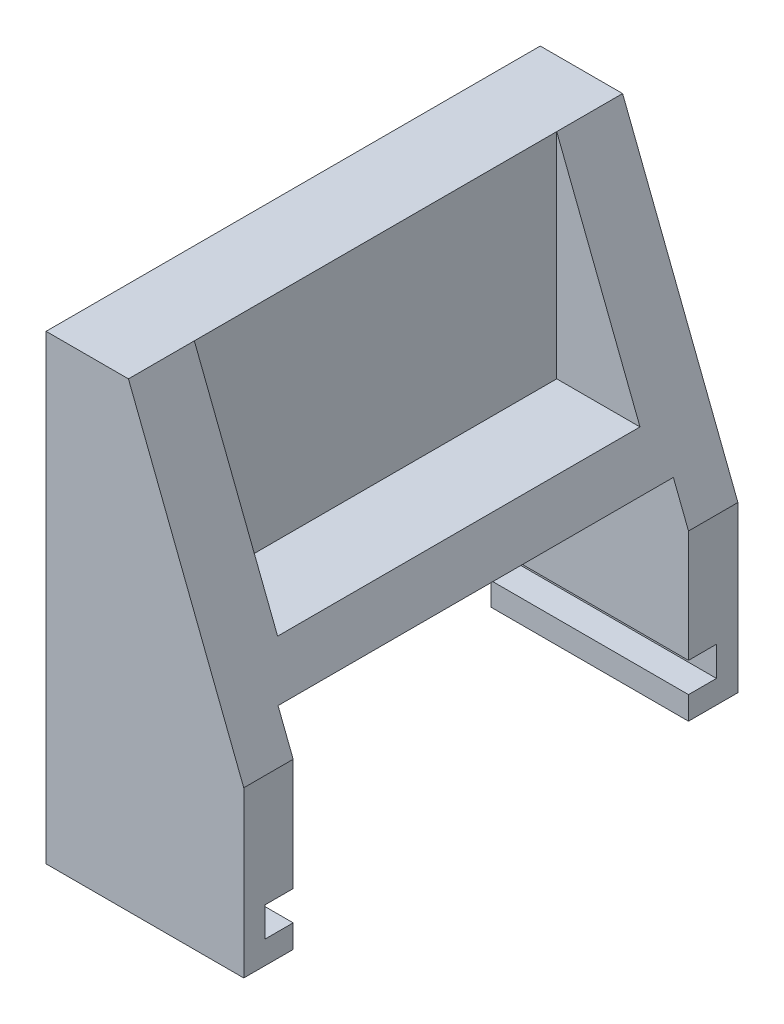
ISO-10303-21;
HEADER;
FILE_DESCRIPTION(('STEP AP214'),'2;1');
FILE_NAME('part.step','',(''),(''),'','','');
FILE_SCHEMA(('AUTOMOTIVE_DESIGN { 1 0 10303 214 1 1 1 1 }'));
ENDSEC;
DATA;
#1=APPLICATION_CONTEXT('core data for automotive mechanical design processes');
#2=APPLICATION_PROTOCOL_DEFINITION('international standard','automotive_design',2000,#1);
#3=PRODUCT_CONTEXT('',#1,'mechanical');
#4=PRODUCT('Part','Part','',(#3));
#5=PRODUCT_RELATED_PRODUCT_CATEGORY('part','',(#4));
#6=PRODUCT_DEFINITION_FORMATION('','',#4);
#7=PRODUCT_DEFINITION_CONTEXT('part definition',#1,'design');
#8=PRODUCT_DEFINITION('design','',#6,#7);
#9=PRODUCT_DEFINITION_SHAPE('','',#8);
#10=(LENGTH_UNIT() NAMED_UNIT(*) SI_UNIT(.MILLI.,.METRE.));
#11=(NAMED_UNIT(*) PLANE_ANGLE_UNIT() SI_UNIT($,.RADIAN.));
#12=(NAMED_UNIT(*) SI_UNIT($,.STERADIAN.) SOLID_ANGLE_UNIT());
#13=UNCERTAINTY_MEASURE_WITH_UNIT(LENGTH_MEASURE(1.E-05),#10,'distance_accuracy_value','');
#14=(GEOMETRIC_REPRESENTATION_CONTEXT(3) GLOBAL_UNCERTAINTY_ASSIGNED_CONTEXT((#13)) GLOBAL_UNIT_ASSIGNED_CONTEXT((#10,
#11,#12)) REPRESENTATION_CONTEXT('',''));
#15=CARTESIAN_POINT('',(0.,0.,0.));
#16=DIRECTION('',(0.,0.,1.));
#17=DIRECTION('',(1.,0.,0.));
#18=AXIS2_PLACEMENT_3D('',#15,#16,#17);
#19=CARTESIAN_POINT('',(12.,-28.,-30.));
#20=DIRECTION('',(1.,0.,0.));
#21=DIRECTION('',(0.,0.,-1.));
#22=AXIS2_PLACEMENT_3D('',#19,#20,#21);
#23=PLANE('',#22);
#24=DIRECTION('',(0.,-1.,0.));
#25=VECTOR('',#24,1.);
#26=CARTESIAN_POINT('',(12.,-28.,-28.7));
#27=LINE('',#26,#25);
#28=CARTESIAN_POINT('',(12.,-24.8,-28.7));
#29=VERTEX_POINT('',#28);
#30=CARTESIAN_POINT('',(12.,-26.6,-28.7));
#31=VERTEX_POINT('',#30);
#32=EDGE_CURVE('E321',#29,#31,#27,.T.);
#33=ORIENTED_EDGE('',*,*,#32,.T.);
#34=DIRECTION('',(0.,0.,1.));
#35=VECTOR('',#34,1.);
#36=CARTESIAN_POINT('',(12.,-26.6,-30.));
#37=LINE('',#36,#35);
#38=CARTESIAN_POINT('',(12.,-26.6,-27.));
#39=VERTEX_POINT('',#38);
#40=EDGE_CURVE('E317',#31,#39,#37,.T.);
#41=ORIENTED_EDGE('',*,*,#40,.T.);
#42=DIRECTION('',(0.,1.,0.));
#43=VECTOR('',#42,1.);
#44=CARTESIAN_POINT('',(12.,-28.,-27.));
#45=LINE('',#44,#43);
#46=CARTESIAN_POINT('',(12.,-28.,-27.));
#47=VERTEX_POINT('',#46);
#48=EDGE_CURVE('E392',#47,#39,#45,.T.);
#49=ORIENTED_EDGE('',*,*,#48,.F.);
#50=DIRECTION('',(0.,0.,1.));
#51=VECTOR('',#50,1.);
#52=CARTESIAN_POINT('',(12.,-28.,-30.));
#53=LINE('',#52,#51);
#54=CARTESIAN_POINT('',(12.,-28.,-30.));
#55=VERTEX_POINT('',#54);
#56=EDGE_CURVE('E451',#55,#47,#53,.T.);
#57=ORIENTED_EDGE('',*,*,#56,.F.);
#58=DIRECTION('',(0.,1.,0.));
#59=VECTOR('',#58,1.);
#60=CARTESIAN_POINT('',(12.,-28.,-30.));
#61=LINE('',#60,#59);
#62=CARTESIAN_POINT('',(12.,-18.,-30.));
#63=VERTEX_POINT('',#62);
#64=EDGE_CURVE('E413',#55,#63,#61,.T.);
#65=ORIENTED_EDGE('',*,*,#64,.T.);
#66=DIRECTION('',(0.,0.,1.));
#67=VECTOR('',#66,1.);
#68=CARTESIAN_POINT('',(12.,-18.,-30.));
#69=LINE('',#68,#67);
#70=CARTESIAN_POINT('',(12.,-18.,-27.));
#71=VERTEX_POINT('',#70);
#72=EDGE_CURVE('E446',#63,#71,#69,.T.);
#73=ORIENTED_EDGE('',*,*,#72,.T.);
#74=CARTESIAN_POINT('',(12.,-24.8,-27.));
#75=VERTEX_POINT('',#74);
#76=EDGE_CURVE('E391',#75,#71,#45,.T.);
#77=ORIENTED_EDGE('',*,*,#76,.F.);
#78=DIRECTION('',(0.,0.,-1.));
#79=VECTOR('',#78,1.);
#80=CARTESIAN_POINT('',(12.,-24.8,-30.));
#81=LINE('',#80,#79);
#82=EDGE_CURVE('E311',#75,#29,#81,.T.);
#83=ORIENTED_EDGE('',*,*,#82,.T.);
#84=EDGE_LOOP('',(#33,#41,#49,#57,#65,#73,#77,#83));
#85=FACE_BOUND('',#84,.T.);
#86=ADVANCED_FACE('F39',(#85),#23,.T.);
#87=CARTESIAN_POINT('',(0.,0.,-30.));
#88=DIRECTION('',(-1.,0.,0.));
#89=DIRECTION('',(0.,-1.,0.));
#90=AXIS2_PLACEMENT_3D('',#87,#88,#89);
#91=PLANE('',#90);
#92=DIRECTION('',(0.,0.,-1.));
#93=VECTOR('',#92,1.);
#94=CARTESIAN_POINT('',(0.,-12.,-12.));
#95=LINE('',#94,#93);
#96=CARTESIAN_POINT('',(0.,-12.,-12.));
#97=VERTEX_POINT('',#96);
#98=CARTESIAN_POINT('',(0.,-12.,-15.));
#99=VERTEX_POINT('',#98);
#100=EDGE_CURVE('E239',#97,#99,#95,.T.);
#101=ORIENTED_EDGE('',*,*,#100,.F.);
#102=DIRECTION('',(0.,-1.,0.));
#103=VECTOR('',#102,1.);
#104=CARTESIAN_POINT('',(0.,-12.,-12.));
#105=LINE('',#104,#103);
#106=CARTESIAN_POINT('',(0.,-15.,-12.));
#107=VERTEX_POINT('',#106);
#108=EDGE_CURVE('E864',#97,#107,#105,.T.);
#109=ORIENTED_EDGE('',*,*,#108,.T.);
#110=DIRECTION('',(0.,0.,-1.));
#111=VECTOR('',#110,1.);
#112=CARTESIAN_POINT('',(0.,-15.,-12.));
#113=LINE('',#112,#111);
#114=CARTESIAN_POINT('',(0.,-15.,-15.));
#115=VERTEX_POINT('',#114);
#116=EDGE_CURVE('E255',#107,#115,#113,.T.);
#117=ORIENTED_EDGE('',*,*,#116,.T.);
#118=DIRECTION('',(0.,-1.,0.));
#119=VECTOR('',#118,1.);
#120=CARTESIAN_POINT('',(0.,-12.,-15.));
#121=LINE('',#120,#119);
#122=EDGE_CURVE('E55',#99,#115,#121,.T.);
#123=ORIENTED_EDGE('',*,*,#122,.F.);
#124=EDGE_LOOP('',(#101,#109,#117,#123));
#125=FACE_BOUND('',#124,.T.);
#126=DIRECTION('',(0.,-1.,0.));
#127=VECTOR('',#126,1.);
#128=CARTESIAN_POINT('',(0.,-15.6385994006733,-27.));
#129=LINE('',#128,#127);
#130=CARTESIAN_POINT('',(0.,-26.6,-27.));
#131=VERTEX_POINT('',#130);
#132=CARTESIAN_POINT('',(0.,-28.,-27.));
#133=VERTEX_POINT('',#132);
#134=EDGE_CURVE('E360',#131,#133,#129,.T.);
#135=ORIENTED_EDGE('',*,*,#134,.F.);
#136=DIRECTION('',(0.,0.,-1.));
#137=VECTOR('',#136,1.);
#138=CARTESIAN_POINT('',(0.,-26.6,-27.));
#139=LINE('',#138,#137);
#140=CARTESIAN_POINT('',(0.,-26.6,-28.7));
#141=VERTEX_POINT('',#140);
#142=EDGE_CURVE('E303',#131,#141,#139,.T.);
#143=ORIENTED_EDGE('',*,*,#142,.T.);
#144=DIRECTION('',(0.,1.,0.));
#145=VECTOR('',#144,1.);
#146=CARTESIAN_POINT('',(0.,-24.8,-28.7));
#147=LINE('',#146,#145);
#148=CARTESIAN_POINT('',(0.,-24.8,-28.7));
#149=VERTEX_POINT('',#148);
#150=EDGE_CURVE('E299',#141,#149,#147,.T.);
#151=ORIENTED_EDGE('',*,*,#150,.T.);
#152=DIRECTION('',(0.,0.,1.));
#153=VECTOR('',#152,1.);
#154=CARTESIAN_POINT('',(0.,-24.8,-27.));
#155=LINE('',#154,#153);
#156=CARTESIAN_POINT('',(0.,-24.8,-27.));
#157=VERTEX_POINT('',#156);
#158=EDGE_CURVE('E290',#149,#157,#155,.T.);
#159=ORIENTED_EDGE('',*,*,#158,.T.);
#160=CARTESIAN_POINT('',(0.,-15.6385994006733,-27.));
#161=VERTEX_POINT('',#160);
#162=EDGE_CURVE('E361',#161,#157,#129,.T.);
#163=ORIENTED_EDGE('',*,*,#162,.F.);
#164=DIRECTION('',(0.,0.,1.));
#165=VECTOR('',#164,1.);
#166=CARTESIAN_POINT('',(0.,-15.6385994006733,-27.));
#167=LINE('',#166,#165);
#168=CARTESIAN_POINT('',(0.,-15.6385994006733,-3.));
#169=VERTEX_POINT('',#168);
#170=EDGE_CURVE('E356',#161,#169,#167,.T.);
#171=ORIENTED_EDGE('',*,*,#170,.T.);
#172=DIRECTION('',(0.,-1.,0.));
#173=VECTOR('',#172,1.);
#174=CARTESIAN_POINT('',(0.,-15.6385994006733,-3.));
#175=LINE('',#174,#173);
#176=CARTESIAN_POINT('',(0.,-24.8,-3.));
#177=VERTEX_POINT('',#176);
#178=EDGE_CURVE('E352',#169,#177,#175,.T.);
#179=ORIENTED_EDGE('',*,*,#178,.T.);
#180=DIRECTION('',(0.,0.,-1.));
#181=VECTOR('',#180,1.);
#182=CARTESIAN_POINT('',(0.,-24.8,-3.));
#183=LINE('',#182,#181);
#184=CARTESIAN_POINT('',(0.,-24.8,-1.3));
#185=VERTEX_POINT('',#184);
#186=EDGE_CURVE('E333',#185,#177,#183,.T.);
#187=ORIENTED_EDGE('',*,*,#186,.F.);
#188=DIRECTION('',(0.,1.,0.));
#189=VECTOR('',#188,1.);
#190=CARTESIAN_POINT('',(0.,-24.8,-1.3));
#191=LINE('',#190,#189);
#192=CARTESIAN_POINT('',(0.,-26.6,-1.3));
#193=VERTEX_POINT('',#192);
#194=EDGE_CURVE('E329',#193,#185,#191,.T.);
#195=ORIENTED_EDGE('',*,*,#194,.F.);
#196=DIRECTION('',(0.,0.,1.));
#197=VECTOR('',#196,1.);
#198=CARTESIAN_POINT('',(0.,-26.6,-3.));
#199=LINE('',#198,#197);
#200=CARTESIAN_POINT('',(0.,-26.6,-3.));
#201=VERTEX_POINT('',#200);
#202=EDGE_CURVE('E325',#201,#193,#199,.T.);
#203=ORIENTED_EDGE('',*,*,#202,.F.);
#204=CARTESIAN_POINT('',(0.,-28.,-3.));
#205=VERTEX_POINT('',#204);
#206=EDGE_CURVE('E351',#201,#205,#175,.T.);
#207=ORIENTED_EDGE('',*,*,#206,.T.);
#208=DIRECTION('',(0.,0.,1.));
#209=VECTOR('',#208,1.);
#210=CARTESIAN_POINT('',(0.,-28.,-30.));
#211=LINE('',#210,#209);
#212=CARTESIAN_POINT('',(0.,-28.,0.));
#213=VERTEX_POINT('',#212);
#214=EDGE_CURVE('E460',#205,#213,#211,.T.);
#215=ORIENTED_EDGE('',*,*,#214,.T.);
#216=DIRECTION('',(0.,-1.,0.));
#217=VECTOR('',#216,1.);
#218=CARTESIAN_POINT('',(0.,0.,0.));
#219=LINE('',#218,#217);
#220=CARTESIAN_POINT('',(0.,0.,0.));
#221=VERTEX_POINT('',#220);
#222=EDGE_CURVE('E425',#221,#213,#219,.T.);
#223=ORIENTED_EDGE('',*,*,#222,.F.);
#224=DIRECTION('',(0.,0.,1.));
#225=VECTOR('',#224,1.);
#226=CARTESIAN_POINT('',(0.,0.,-30.));
#227=LINE('',#226,#225);
#228=CARTESIAN_POINT('',(0.,0.,-30.));
#229=VERTEX_POINT('',#228);
#230=EDGE_CURVE('E421',#229,#221,#227,.T.);
#231=ORIENTED_EDGE('',*,*,#230,.F.);
#232=DIRECTION('',(0.,-1.,0.));
#233=VECTOR('',#232,1.);
#234=CARTESIAN_POINT('',(0.,0.,-30.));
#235=LINE('',#234,#233);
#236=CARTESIAN_POINT('',(0.,-28.,-30.));
#237=VERTEX_POINT('',#236);
#238=EDGE_CURVE('E404',#229,#237,#235,.T.);
#239=ORIENTED_EDGE('',*,*,#238,.T.);
#240=EDGE_CURVE('E456',#237,#133,#211,.T.);
#241=ORIENTED_EDGE('',*,*,#240,.T.);
#242=EDGE_LOOP('',(#135,#143,#151,#159,#163,#171,#179,#187,#195,#203,#207,#215,#223,#231,#239,#241));
#243=FACE_BOUND('',#242,.T.);
#244=ADVANCED_FACE('F252',(#125,#243),#91,.T.);
#245=CARTESIAN_POINT('',(25.,-15.6385994006733,-27.));
#246=DIRECTION('',(0.,0.,-1.));
#247=DIRECTION('',(0.,1.,0.));
#248=AXIS2_PLACEMENT_3D('',#245,#246,#247);
#249=PLANE('',#248);
#250=DIRECTION('',(1.,0.,0.));
#251=VECTOR('',#250,1.);
#252=CARTESIAN_POINT('',(25.,-26.6,-27.));
#253=LINE('',#252,#251);
#254=EDGE_CURVE('E471',#131,#39,#253,.T.);
#255=ORIENTED_EDGE('',*,*,#254,.F.);
#256=ORIENTED_EDGE('',*,*,#134,.T.);
#257=DIRECTION('',(1.,0.,0.));
#258=VECTOR('',#257,1.);
#259=CARTESIAN_POINT('',(0.,-28.,-27.));
#260=LINE('',#259,#258);
#261=EDGE_CURVE('E388',#133,#47,#260,.T.);
#262=ORIENTED_EDGE('',*,*,#261,.T.);
#263=ORIENTED_EDGE('',*,*,#48,.T.);
#264=EDGE_LOOP('',(#255,#256,#262,#263));
#265=FACE_BOUND('',#264,.T.);
#266=ADVANCED_FACE('F498',(#265),#249,.F.);
#267=DIRECTION('',(-1.,0.,0.));
#268=VECTOR('',#267,1.);
#269=CARTESIAN_POINT('',(25.,-24.8,-27.));
#270=LINE('',#269,#268);
#271=EDGE_CURVE('E468',#75,#157,#270,.T.);
#272=ORIENTED_EDGE('',*,*,#271,.F.);
#273=ORIENTED_EDGE('',*,*,#76,.T.);
#274=DIRECTION('',(-0.362446261154949,0.932004671541296,0.));
#275=VECTOR('',#274,1.);
#276=CARTESIAN_POINT('',(12.,-18.,-27.));
#277=LINE('',#276,#275);
#278=CARTESIAN_POINT('',(11.0816775447063,-15.6385994006733,-27.));
#279=VERTEX_POINT('',#278);
#280=EDGE_CURVE('E396',#71,#279,#277,.T.);
#281=ORIENTED_EDGE('',*,*,#280,.T.);
#282=DIRECTION('',(-1.,0.,0.));
#283=VECTOR('',#282,1.);
#284=CARTESIAN_POINT('',(25.,-15.6385994006733,-27.));
#285=LINE('',#284,#283);
#286=EDGE_CURVE('E366',#279,#161,#285,.T.);
#287=ORIENTED_EDGE('',*,*,#286,.T.);
#288=ORIENTED_EDGE('',*,*,#162,.T.);
#289=EDGE_LOOP('',(#272,#273,#281,#287,#288));
#290=FACE_BOUND('',#289,.T.);
#291=ADVANCED_FACE('F513',(#290),#249,.F.);
#292=CARTESIAN_POINT('',(25.,-15.6385994006733,-3.));
#293=DIRECTION('',(0.,0.,-1.));
#294=DIRECTION('',(-1.,0.,0.));
#295=AXIS2_PLACEMENT_3D('',#292,#293,#294);
#296=PLANE('',#295);
#297=DIRECTION('',(1.,0.,0.));
#298=VECTOR('',#297,1.);
#299=CARTESIAN_POINT('',(25.,-24.8,-3.));
#300=LINE('',#299,#298);
#301=CARTESIAN_POINT('',(12.,-24.8,-3.));
#302=VERTEX_POINT('',#301);
#303=EDGE_CURVE('E465',#177,#302,#300,.T.);
#304=ORIENTED_EDGE('',*,*,#303,.F.);
#305=ORIENTED_EDGE('',*,*,#178,.F.);
#306=DIRECTION('',(-1.,0.,0.));
#307=VECTOR('',#306,1.);
#308=CARTESIAN_POINT('',(25.,-15.6385994006733,-3.));
#309=LINE('',#308,#307);
#310=CARTESIAN_POINT('',(11.0816775447063,-15.6385994006733,-3.));
#311=VERTEX_POINT('',#310);
#312=EDGE_CURVE('E365',#311,#169,#309,.T.);
#313=ORIENTED_EDGE('',*,*,#312,.F.);
#314=DIRECTION('',(-0.362446261154949,0.932004671541296,0.));
#315=VECTOR('',#314,1.);
#316=CARTESIAN_POINT('',(12.,-18.,-3.));
#317=LINE('',#316,#315);
#318=CARTESIAN_POINT('',(12.,-18.,-3.));
#319=VERTEX_POINT('',#318);
#320=EDGE_CURVE('E380',#319,#311,#317,.T.);
#321=ORIENTED_EDGE('',*,*,#320,.F.);
#322=DIRECTION('',(0.,1.,0.));
#323=VECTOR('',#322,1.);
#324=CARTESIAN_POINT('',(12.,-28.,-3.));
#325=LINE('',#324,#323);
#326=EDGE_CURVE('E375',#302,#319,#325,.T.);
#327=ORIENTED_EDGE('',*,*,#326,.F.);
#328=EDGE_LOOP('',(#304,#305,#313,#321,#327));
#329=FACE_BOUND('',#328,.T.);
#330=ADVANCED_FACE('F504',(#329),#296,.T.);
#331=DIRECTION('',(0.,0.,1.));
#332=VECTOR('',#331,1.);
#333=CARTESIAN_POINT('',(12.,-24.8,-30.));
#334=LINE('',#333,#332);
#335=CARTESIAN_POINT('',(12.,-24.8,-1.3));
#336=VERTEX_POINT('',#335);
#337=EDGE_CURVE('E345',#302,#336,#334,.T.);
#338=ORIENTED_EDGE('',*,*,#337,.F.);
#339=ORIENTED_EDGE('',*,*,#326,.T.);
#340=CARTESIAN_POINT('',(12.,-18.,0.));
#341=VERTEX_POINT('',#340);
#342=EDGE_CURVE('E450',#319,#341,#69,.T.);
#343=ORIENTED_EDGE('',*,*,#342,.T.);
#344=DIRECTION('',(0.,1.,0.));
#345=VECTOR('',#344,1.);
#346=CARTESIAN_POINT('',(12.,-28.,0.));
#347=LINE('',#346,#345);
#348=CARTESIAN_POINT('',(12.,-28.,0.));
#349=VERTEX_POINT('',#348);
#350=EDGE_CURVE('E433',#349,#341,#347,.T.);
#351=ORIENTED_EDGE('',*,*,#350,.F.);
#352=CARTESIAN_POINT('',(12.,-28.,-3.));
#353=VERTEX_POINT('',#352);
#354=EDGE_CURVE('E455',#353,#349,#53,.T.);
#355=ORIENTED_EDGE('',*,*,#354,.F.);
#356=CARTESIAN_POINT('',(12.,-26.6,-3.));
#357=VERTEX_POINT('',#356);
#358=EDGE_CURVE('E376',#353,#357,#325,.T.);
#359=ORIENTED_EDGE('',*,*,#358,.T.);
#360=DIRECTION('',(0.,0.,-1.));
#361=VECTOR('',#360,1.);
#362=CARTESIAN_POINT('',(12.,-26.6,-30.));
#363=LINE('',#362,#361);
#364=CARTESIAN_POINT('',(12.,-26.6,-1.3));
#365=VERTEX_POINT('',#364);
#366=EDGE_CURVE('E340',#365,#357,#363,.T.);
#367=ORIENTED_EDGE('',*,*,#366,.F.);
#368=DIRECTION('',(0.,-1.,0.));
#369=VECTOR('',#368,1.);
#370=CARTESIAN_POINT('',(12.,-28.,-1.3));
#371=LINE('',#370,#369);
#372=EDGE_CURVE('E348',#336,#365,#371,.T.);
#373=ORIENTED_EDGE('',*,*,#372,.F.);
#374=EDGE_LOOP('',(#338,#339,#343,#351,#355,#359,#367,#373));
#375=FACE_BOUND('',#374,.T.);
#376=ADVANCED_FACE('F494',(#375),#23,.T.);
#377=CARTESIAN_POINT('',(0.,-28.,-30.));
#378=DIRECTION('',(0.,-1.,0.));
#379=DIRECTION('',(0.,0.,-1.));
#380=AXIS2_PLACEMENT_3D('',#377,#378,#379);
#381=PLANE('',#380);
#382=ORIENTED_EDGE('',*,*,#214,.F.);
#383=DIRECTION('',(1.,0.,0.));
#384=VECTOR('',#383,1.);
#385=CARTESIAN_POINT('',(0.,-28.,-3.));
#386=LINE('',#385,#384);
#387=EDGE_CURVE('E369',#205,#353,#386,.T.);
#388=ORIENTED_EDGE('',*,*,#387,.T.);
#389=ORIENTED_EDGE('',*,*,#354,.T.);
#390=DIRECTION('',(1.,0.,0.));
#391=VECTOR('',#390,1.);
#392=CARTESIAN_POINT('',(0.,-28.,0.));
#393=LINE('',#392,#391);
#394=EDGE_CURVE('E429',#213,#349,#393,.T.);
#395=ORIENTED_EDGE('',*,*,#394,.F.);
#396=EDGE_LOOP('',(#382,#388,#389,#395));
#397=FACE_BOUND('',#396,.T.);
#398=ADVANCED_FACE('F503',(#397),#381,.T.);
#399=CARTESIAN_POINT('',(5.,0.,-30.));
#400=DIRECTION('',(0.,1.,0.));
#401=DIRECTION('',(-1.,0.,0.));
#402=AXIS2_PLACEMENT_3D('',#399,#400,#401);
#403=PLANE('',#402);
#404=DIRECTION('',(-1.,0.,0.));
#405=VECTOR('',#404,1.);
#406=CARTESIAN_POINT('',(5.,0.,0.));
#407=LINE('',#406,#405);
#408=CARTESIAN_POINT('',(5.,0.,0.));
#409=VERTEX_POINT('',#408);
#410=EDGE_CURVE('E399',#409,#221,#407,.T.);
#411=ORIENTED_EDGE('',*,*,#410,.F.);
#412=DIRECTION('',(0.,0.,1.));
#413=VECTOR('',#412,1.);
#414=CARTESIAN_POINT('',(5.,0.,-30.));
#415=LINE('',#414,#413);
#416=CARTESIAN_POINT('',(5.,0.,-4.));
#417=VERTEX_POINT('',#416);
#418=EDGE_CURVE('E445',#417,#409,#415,.T.);
#419=ORIENTED_EDGE('',*,*,#418,.F.);
#420=DIRECTION('',(0.,0.,1.));
#421=VECTOR('',#420,1.);
#422=CARTESIAN_POINT('',(5.,0.,-26.));
#423=LINE('',#422,#421);
#424=CARTESIAN_POINT('',(5.,0.,-26.));
#425=VERTEX_POINT('',#424);
#426=EDGE_CURVE('E279',#425,#417,#423,.T.);
#427=ORIENTED_EDGE('',*,*,#426,.F.);
#428=CARTESIAN_POINT('',(5.,0.,-30.));
#429=VERTEX_POINT('',#428);
#430=EDGE_CURVE('E440',#429,#425,#415,.T.);
#431=ORIENTED_EDGE('',*,*,#430,.F.);
#432=DIRECTION('',(-1.,0.,0.));
#433=VECTOR('',#432,1.);
#434=CARTESIAN_POINT('',(5.,0.,-30.));
#435=LINE('',#434,#433);
#436=EDGE_CURVE('E400',#429,#229,#435,.T.);
#437=ORIENTED_EDGE('',*,*,#436,.T.);
#438=ORIENTED_EDGE('',*,*,#230,.T.);
#439=EDGE_LOOP('',(#411,#419,#427,#431,#437,#438));
#440=FACE_BOUND('',#439,.T.);
#441=ADVANCED_FACE('F510',(#440),#403,.T.);
#442=CARTESIAN_POINT('',(12.,-18.,-30.));
#443=DIRECTION('',(0.932004671541296,0.362446261154949,0.));
#444=DIRECTION('',(-0.362446261154949,0.932004671541296,0.));
#445=AXIS2_PLACEMENT_3D('',#442,#443,#444);
#446=PLANE('',#445);
#447=DIRECTION('',(-0.362446261154949,0.932004671541296,0.));
#448=VECTOR('',#447,1.);
#449=CARTESIAN_POINT('',(10.0555555555556,-13.,-26.));
#450=LINE('',#449,#448);
#451=CARTESIAN_POINT('',(10.0555555555556,-13.,-26.));
#452=VERTEX_POINT('',#451);
#453=EDGE_CURVE('E267',#452,#425,#450,.T.);
#454=ORIENTED_EDGE('',*,*,#453,.F.);
#455=DIRECTION('',(0.,0.,1.));
#456=VECTOR('',#455,1.);
#457=CARTESIAN_POINT('',(10.0555555555556,-13.,-26.));
#458=LINE('',#457,#456);
#459=CARTESIAN_POINT('',(10.0555555555556,-13.,-4.));
#460=VERTEX_POINT('',#459);
#461=EDGE_CURVE('E286',#452,#460,#458,.T.);
#462=ORIENTED_EDGE('',*,*,#461,.T.);
#463=DIRECTION('',(-0.362446261154949,0.932004671541296,0.));
#464=VECTOR('',#463,1.);
#465=CARTESIAN_POINT('',(10.0555555555556,-13.,-4.));
#466=LINE('',#465,#464);
#467=EDGE_CURVE('E257',#460,#417,#466,.T.);
#468=ORIENTED_EDGE('',*,*,#467,.T.);
#469=ORIENTED_EDGE('',*,*,#418,.T.);
#470=DIRECTION('',(-0.362446261154949,0.932004671541296,0.));
#471=VECTOR('',#470,1.);
#472=CARTESIAN_POINT('',(12.,-18.,0.));
#473=LINE('',#472,#471);
#474=EDGE_CURVE('E405',#341,#409,#473,.T.);
#475=ORIENTED_EDGE('',*,*,#474,.F.);
#476=ORIENTED_EDGE('',*,*,#342,.F.);
#477=ORIENTED_EDGE('',*,*,#320,.T.);
#478=DIRECTION('',(0.,0.,-1.));
#479=VECTOR('',#478,1.);
#480=CARTESIAN_POINT('',(11.0816775447063,-15.6385994006733,-30.));
#481=LINE('',#480,#479);
#482=EDGE_CURVE('E384',#311,#279,#481,.T.);
#483=ORIENTED_EDGE('',*,*,#482,.T.);
#484=ORIENTED_EDGE('',*,*,#280,.F.);
#485=ORIENTED_EDGE('',*,*,#72,.F.);
#486=DIRECTION('',(-0.362446261154949,0.932004671541296,0.));
#487=VECTOR('',#486,1.);
#488=CARTESIAN_POINT('',(12.,-18.,-30.));
#489=LINE('',#488,#487);
#490=EDGE_CURVE('E417',#63,#429,#489,.T.);
#491=ORIENTED_EDGE('',*,*,#490,.T.);
#492=ORIENTED_EDGE('',*,*,#430,.T.);
#493=EDGE_LOOP('',(#454,#462,#468,#469,#475,#476,#477,#483,#484,#485,#491,#492));
#494=FACE_BOUND('',#493,.T.);
#495=ADVANCED_FACE('F552',(#494),#446,.T.);
#496=ORIENTED_EDGE('',*,*,#261,.F.);
#497=ORIENTED_EDGE('',*,*,#240,.F.);
#498=DIRECTION('',(1.,0.,0.));
#499=VECTOR('',#498,1.);
#500=CARTESIAN_POINT('',(0.,-28.,-30.));
#501=LINE('',#500,#499);
#502=EDGE_CURVE('E409',#237,#55,#501,.T.);
#503=ORIENTED_EDGE('',*,*,#502,.T.);
#504=ORIENTED_EDGE('',*,*,#56,.T.);
#505=EDGE_LOOP('',(#496,#497,#503,#504));
#506=FACE_BOUND('',#505,.T.);
#507=ADVANCED_FACE('F512',(#506),#381,.T.);
#508=CARTESIAN_POINT('',(0.,0.,-30.));
#509=DIRECTION('',(0.,0.,1.));
#510=DIRECTION('',(1.,0.,0.));
#511=AXIS2_PLACEMENT_3D('',#508,#509,#510);
#512=PLANE('',#511);
#513=ORIENTED_EDGE('',*,*,#436,.F.);
#514=ORIENTED_EDGE('',*,*,#490,.F.);
#515=ORIENTED_EDGE('',*,*,#64,.F.);
#516=ORIENTED_EDGE('',*,*,#502,.F.);
#517=ORIENTED_EDGE('',*,*,#238,.F.);
#518=EDGE_LOOP('',(#513,#514,#515,#516,#517));
#519=FACE_BOUND('',#518,.T.);
#520=ADVANCED_FACE('F559',(#519),#512,.F.);
#521=CARTESIAN_POINT('',(0.,0.,0.));
#522=DIRECTION('',(0.,0.,1.));
#523=DIRECTION('',(1.,0.,0.));
#524=AXIS2_PLACEMENT_3D('',#521,#522,#523);
#525=PLANE('',#524);
#526=ORIENTED_EDGE('',*,*,#410,.T.);
#527=ORIENTED_EDGE('',*,*,#222,.T.);
#528=ORIENTED_EDGE('',*,*,#394,.T.);
#529=ORIENTED_EDGE('',*,*,#350,.T.);
#530=ORIENTED_EDGE('',*,*,#474,.T.);
#531=EDGE_LOOP('',(#526,#527,#528,#529,#530));
#532=FACE_BOUND('',#531,.T.);
#533=ADVANCED_FACE('F615',(#532),#525,.T.);
#534=CARTESIAN_POINT('',(25.,-15.6385994006733,-27.));
#535=DIRECTION('',(0.,-1.,0.));
#536=DIRECTION('',(0.,0.,-1.));
#537=AXIS2_PLACEMENT_3D('',#534,#535,#536);
#538=PLANE('',#537);
#539=ORIENTED_EDGE('',*,*,#312,.T.);
#540=ORIENTED_EDGE('',*,*,#170,.F.);
#541=ORIENTED_EDGE('',*,*,#286,.F.);
#542=ORIENTED_EDGE('',*,*,#482,.F.);
#543=EDGE_LOOP('',(#539,#540,#541,#542));
#544=FACE_BOUND('',#543,.T.);
#545=ADVANCED_FACE('F613',(#544),#538,.T.);
#546=DIRECTION('',(-1.,0.,0.));
#547=VECTOR('',#546,1.);
#548=CARTESIAN_POINT('',(25.,-26.6,-3.));
#549=LINE('',#548,#547);
#550=EDGE_CURVE('E444',#357,#201,#549,.T.);
#551=ORIENTED_EDGE('',*,*,#550,.F.);
#552=ORIENTED_EDGE('',*,*,#358,.F.);
#553=ORIENTED_EDGE('',*,*,#387,.F.);
#554=ORIENTED_EDGE('',*,*,#206,.F.);
#555=EDGE_LOOP('',(#551,#552,#553,#554));
#556=FACE_BOUND('',#555,.T.);
#557=ADVANCED_FACE('F516',(#556),#296,.T.);
#558=CARTESIAN_POINT('',(15.,-24.8,-3.));
#559=DIRECTION('',(0.,1.,0.));
#560=DIRECTION('',(0.,0.,1.));
#561=AXIS2_PLACEMENT_3D('',#558,#559,#560);
#562=PLANE('',#561);
#563=ORIENTED_EDGE('',*,*,#337,.T.);
#564=DIRECTION('',(-1.,0.,0.));
#565=VECTOR('',#564,1.);
#566=CARTESIAN_POINT('',(15.,-24.8,-1.3));
#567=LINE('',#566,#565);
#568=EDGE_CURVE('E337',#336,#185,#567,.T.);
#569=ORIENTED_EDGE('',*,*,#568,.T.);
#570=ORIENTED_EDGE('',*,*,#186,.T.);
#571=ORIENTED_EDGE('',*,*,#303,.T.);
#572=EDGE_LOOP('',(#563,#569,#570,#571));
#573=FACE_BOUND('',#572,.T.);
#574=ADVANCED_FACE('F600',(#573),#562,.F.);
#575=CARTESIAN_POINT('',(15.,-24.8,-1.3));
#576=DIRECTION('',(0.,0.,1.));
#577=DIRECTION('',(0.,-1.,0.));
#578=AXIS2_PLACEMENT_3D('',#575,#576,#577);
#579=PLANE('',#578);
#580=ORIENTED_EDGE('',*,*,#372,.T.);
#581=DIRECTION('',(-1.,0.,0.));
#582=VECTOR('',#581,1.);
#583=CARTESIAN_POINT('',(15.,-26.6,-1.3));
#584=LINE('',#583,#582);
#585=EDGE_CURVE('E336',#365,#193,#584,.T.);
#586=ORIENTED_EDGE('',*,*,#585,.T.);
#587=ORIENTED_EDGE('',*,*,#194,.T.);
#588=ORIENTED_EDGE('',*,*,#568,.F.);
#589=EDGE_LOOP('',(#580,#586,#587,#588));
#590=FACE_BOUND('',#589,.T.);
#591=ADVANCED_FACE('F603',(#590),#579,.F.);
#592=CARTESIAN_POINT('',(15.,-26.6,-3.));
#593=DIRECTION('',(0.,-1.,0.));
#594=DIRECTION('',(0.,0.,-1.));
#595=AXIS2_PLACEMENT_3D('',#592,#593,#594);
#596=PLANE('',#595);
#597=ORIENTED_EDGE('',*,*,#366,.T.);
#598=ORIENTED_EDGE('',*,*,#550,.T.);
#599=ORIENTED_EDGE('',*,*,#202,.T.);
#600=ORIENTED_EDGE('',*,*,#585,.F.);
#601=EDGE_LOOP('',(#597,#598,#599,#600));
#602=FACE_BOUND('',#601,.T.);
#603=ADVANCED_FACE('F592',(#602),#596,.F.);
#604=CARTESIAN_POINT('',(15.,-26.6,-27.));
#605=DIRECTION('',(0.,1.,0.));
#606=DIRECTION('',(0.,0.,1.));
#607=AXIS2_PLACEMENT_3D('',#604,#605,#606);
#608=PLANE('',#607);
#609=DIRECTION('',(-1.,0.,0.));
#610=VECTOR('',#609,1.);
#611=CARTESIAN_POINT('',(15.,-26.6,-28.7));
#612=LINE('',#611,#610);
#613=EDGE_CURVE('E308',#31,#141,#612,.T.);
#614=ORIENTED_EDGE('',*,*,#613,.T.);
#615=ORIENTED_EDGE('',*,*,#142,.F.);
#616=ORIENTED_EDGE('',*,*,#254,.T.);
#617=ORIENTED_EDGE('',*,*,#40,.F.);
#618=EDGE_LOOP('',(#614,#615,#616,#617));
#619=FACE_BOUND('',#618,.T.);
#620=ADVANCED_FACE('F588',(#619),#608,.T.);
#621=CARTESIAN_POINT('',(15.,-24.8,-28.7));
#622=DIRECTION('',(0.,0.,1.));
#623=DIRECTION('',(0.,-1.,0.));
#624=AXIS2_PLACEMENT_3D('',#621,#622,#623);
#625=PLANE('',#624);
#626=DIRECTION('',(-1.,0.,0.));
#627=VECTOR('',#626,1.);
#628=CARTESIAN_POINT('',(15.,-24.8,-28.7));
#629=LINE('',#628,#627);
#630=EDGE_CURVE('E307',#29,#149,#629,.T.);
#631=ORIENTED_EDGE('',*,*,#630,.T.);
#632=ORIENTED_EDGE('',*,*,#150,.F.);
#633=ORIENTED_EDGE('',*,*,#613,.F.);
#634=ORIENTED_EDGE('',*,*,#32,.F.);
#635=EDGE_LOOP('',(#631,#632,#633,#634));
#636=FACE_BOUND('',#635,.T.);
#637=ADVANCED_FACE('F591',(#636),#625,.T.);
#638=CARTESIAN_POINT('',(15.,-24.8,-27.));
#639=DIRECTION('',(0.,-1.,0.));
#640=DIRECTION('',(0.,0.,-1.));
#641=AXIS2_PLACEMENT_3D('',#638,#639,#640);
#642=PLANE('',#641);
#643=ORIENTED_EDGE('',*,*,#271,.T.);
#644=ORIENTED_EDGE('',*,*,#158,.F.);
#645=ORIENTED_EDGE('',*,*,#630,.F.);
#646=ORIENTED_EDGE('',*,*,#82,.F.);
#647=EDGE_LOOP('',(#643,#644,#645,#646));
#648=FACE_BOUND('',#647,.T.);
#649=ADVANCED_FACE('F586',(#648),#642,.T.);
#650=CARTESIAN_POINT('',(5.,-13.,-26.));
#651=DIRECTION('',(0.,-1.,0.));
#652=DIRECTION('',(0.,0.,-1.));
#653=AXIS2_PLACEMENT_3D('',#650,#651,#652);
#654=PLANE('',#653);
#655=DIRECTION('',(1.,0.,0.));
#656=VECTOR('',#655,1.);
#657=CARTESIAN_POINT('',(5.,-13.,-4.));
#658=LINE('',#657,#656);
#659=CARTESIAN_POINT('',(5.,-13.,-4.));
#660=VERTEX_POINT('',#659);
#661=EDGE_CURVE('E272',#660,#460,#658,.T.);
#662=ORIENTED_EDGE('',*,*,#661,.T.);
#663=ORIENTED_EDGE('',*,*,#461,.F.);
#664=DIRECTION('',(1.,0.,0.));
#665=VECTOR('',#664,1.);
#666=CARTESIAN_POINT('',(5.,-13.,-26.));
#667=LINE('',#666,#665);
#668=CARTESIAN_POINT('',(5.,-13.,-26.));
#669=VERTEX_POINT('',#668);
#670=EDGE_CURVE('E276',#669,#452,#667,.T.);
#671=ORIENTED_EDGE('',*,*,#670,.F.);
#672=DIRECTION('',(0.,0.,1.));
#673=VECTOR('',#672,1.);
#674=CARTESIAN_POINT('',(5.,-13.,-26.));
#675=LINE('',#674,#673);
#676=EDGE_CURVE('E291',#669,#660,#675,.T.);
#677=ORIENTED_EDGE('',*,*,#676,.T.);
#678=EDGE_LOOP('',(#662,#663,#671,#677));
#679=FACE_BOUND('',#678,.T.);
#680=ADVANCED_FACE('F570',(#679),#654,.F.);
#681=CARTESIAN_POINT('',(5.,0.,-26.));
#682=DIRECTION('',(-1.,0.,0.));
#683=DIRECTION('',(0.,-1.,0.));
#684=AXIS2_PLACEMENT_3D('',#681,#682,#683);
#685=PLANE('',#684);
#686=DIRECTION('',(0.,-1.,0.));
#687=VECTOR('',#686,1.);
#688=CARTESIAN_POINT('',(5.,0.,-4.));
#689=LINE('',#688,#687);
#690=EDGE_CURVE('E63',#417,#660,#689,.T.);
#691=ORIENTED_EDGE('',*,*,#690,.T.);
#692=ORIENTED_EDGE('',*,*,#676,.F.);
#693=DIRECTION('',(0.,-1.,0.));
#694=VECTOR('',#693,1.);
#695=CARTESIAN_POINT('',(5.,0.,-26.));
#696=LINE('',#695,#694);
#697=EDGE_CURVE('E271',#425,#669,#696,.T.);
#698=ORIENTED_EDGE('',*,*,#697,.F.);
#699=ORIENTED_EDGE('',*,*,#426,.T.);
#700=EDGE_LOOP('',(#691,#692,#698,#699));
#701=FACE_BOUND('',#700,.T.);
#702=ADVANCED_FACE('F566',(#701),#685,.F.);
#703=CARTESIAN_POINT('',(0.,0.,-26.));
#704=DIRECTION('',(0.,0.,-1.));
#705=DIRECTION('',(-1.,0.,0.));
#706=AXIS2_PLACEMENT_3D('',#703,#704,#705);
#707=PLANE('',#706);
#708=ORIENTED_EDGE('',*,*,#453,.T.);
#709=ORIENTED_EDGE('',*,*,#697,.T.);
#710=ORIENTED_EDGE('',*,*,#670,.T.);
#711=EDGE_LOOP('',(#708,#709,#710));
#712=FACE_BOUND('',#711,.T.);
#713=ADVANCED_FACE('F573',(#712),#707,.F.);
#714=CARTESIAN_POINT('',(0.,0.,-4.));
#715=DIRECTION('',(0.,0.,-1.));
#716=DIRECTION('',(-1.,0.,0.));
#717=AXIS2_PLACEMENT_3D('',#714,#715,#716);
#718=PLANE('',#717);
#719=ORIENTED_EDGE('',*,*,#467,.F.);
#720=ORIENTED_EDGE('',*,*,#661,.F.);
#721=ORIENTED_EDGE('',*,*,#690,.F.);
#722=EDGE_LOOP('',(#719,#720,#721));
#723=FACE_BOUND('',#722,.T.);
#724=ADVANCED_FACE('F568',(#723),#718,.T.);
#725=CARTESIAN_POINT('',(0.,-12.,-15.));
#726=DIRECTION('',(0.,0.,1.));
#727=DIRECTION('',(1.,0.,0.));
#728=AXIS2_PLACEMENT_3D('',#725,#726,#727);
#729=PLANE('',#728);
#730=DIRECTION('',(-1.,0.,0.));
#731=VECTOR('',#730,1.);
#732=CARTESIAN_POINT('',(0.,-15.,-15.));
#733=LINE('',#732,#731);
#734=CARTESIAN_POINT('',(-3.,-15.,-15.));
#735=VERTEX_POINT('',#734);
#736=EDGE_CURVE('E861',#115,#735,#733,.T.);
#737=ORIENTED_EDGE('',*,*,#736,.T.);
#738=DIRECTION('',(0.,-1.,0.));
#739=VECTOR('',#738,1.);
#740=CARTESIAN_POINT('',(-3.,-12.,-15.));
#741=LINE('',#740,#739);
#742=CARTESIAN_POINT('',(-3.,-12.,-15.));
#743=VERTEX_POINT('',#742);
#744=EDGE_CURVE('E234',#743,#735,#741,.T.);
#745=ORIENTED_EDGE('',*,*,#744,.F.);
#746=DIRECTION('',(-1.,0.,0.));
#747=VECTOR('',#746,1.);
#748=CARTESIAN_POINT('',(0.,-12.,-15.));
#749=LINE('',#748,#747);
#750=EDGE_CURVE('E230',#99,#743,#749,.T.);
#751=ORIENTED_EDGE('',*,*,#750,.F.);
#752=ORIENTED_EDGE('',*,*,#122,.T.);
#753=EDGE_LOOP('',(#737,#745,#751,#752));
#754=FACE_BOUND('',#753,.T.);
#755=ADVANCED_FACE('F232',(#754),#729,.F.);
#756=CARTESIAN_POINT('',(-3.,-12.,-15.));
#757=DIRECTION('',(-0.808122035641759,0.,0.589015089373965));
#758=DIRECTION('',(0.589015089373965,0.,0.808122035641759));
#759=AXIS2_PLACEMENT_3D('',#756,#757,#758);
#760=PLANE('',#759);
#761=DIRECTION('',(-0.589015089373965,0.,-0.808122035641759));
#762=VECTOR('',#761,1.);
#763=CARTESIAN_POINT('',(-3.,-15.,-15.));
#764=LINE('',#763,#762);
#765=CARTESIAN_POINT('',(-5.35606035749586,-15.,-18.232488142567));
#766=VERTEX_POINT('',#765);
#767=EDGE_CURVE('E897',#735,#766,#764,.T.);
#768=ORIENTED_EDGE('',*,*,#767,.T.);
#769=DIRECTION('',(0.,-1.,0.));
#770=VECTOR('',#769,1.);
#771=CARTESIAN_POINT('',(-5.35606035749586,-12.,-18.232488142567));
#772=LINE('',#771,#770);
#773=CARTESIAN_POINT('',(-5.35606035749586,-12.,-18.232488142567));
#774=VERTEX_POINT('',#773);
#775=EDGE_CURVE('E263',#774,#766,#772,.T.);
#776=ORIENTED_EDGE('',*,*,#775,.F.);
#777=DIRECTION('',(-0.589015089373965,0.,-0.808122035641759));
#778=VECTOR('',#777,1.);
#779=CARTESIAN_POINT('',(-3.,-12.,-15.));
#780=LINE('',#779,#778);
#781=EDGE_CURVE('E238',#743,#774,#780,.T.);
#782=ORIENTED_EDGE('',*,*,#781,.F.);
#783=ORIENTED_EDGE('',*,*,#744,.T.);
#784=EDGE_LOOP('',(#768,#776,#782,#783));
#785=FACE_BOUND('',#784,.T.);
#786=ADVANCED_FACE('F757',(#785),#760,.F.);
#787=CARTESIAN_POINT('',(-5.35606035749586,-12.,-18.232488142567));
#788=DIRECTION('',(0.,0.,1.));
#789=DIRECTION('',(1.,0.,0.));
#790=AXIS2_PLACEMENT_3D('',#787,#788,#789);
#791=PLANE('',#790);
#792=DIRECTION('',(-1.,0.,0.));
#793=VECTOR('',#792,1.);
#794=CARTESIAN_POINT('',(-5.35606035749586,-15.,-18.232488142567));
#795=LINE('',#794,#793);
#796=CARTESIAN_POINT('',(-8.35606035749586,-15.,-18.232488142567));
#797=VERTEX_POINT('',#796);
#798=EDGE_CURVE('E894',#766,#797,#795,.T.);
#799=ORIENTED_EDGE('',*,*,#798,.T.);
#800=DIRECTION('',(0.,-1.,0.));
#801=VECTOR('',#800,1.);
#802=CARTESIAN_POINT('',(-8.35606035749586,-12.,-18.232488142567));
#803=LINE('',#802,#801);
#804=CARTESIAN_POINT('',(-8.35606035749586,-12.,-18.232488142567));
#805=VERTEX_POINT('',#804);
#806=EDGE_CURVE('E885',#805,#797,#803,.T.);
#807=ORIENTED_EDGE('',*,*,#806,.F.);
#808=DIRECTION('',(-1.,0.,0.));
#809=VECTOR('',#808,1.);
#810=CARTESIAN_POINT('',(-5.35606035749586,-12.,-18.232488142567));
#811=LINE('',#810,#809);
#812=EDGE_CURVE('E895',#774,#805,#811,.T.);
#813=ORIENTED_EDGE('',*,*,#812,.F.);
#814=ORIENTED_EDGE('',*,*,#775,.T.);
#815=EDGE_LOOP('',(#799,#807,#813,#814));
#816=FACE_BOUND('',#815,.T.);
#817=ADVANCED_FACE('F765',(#816),#791,.F.);
#818=CARTESIAN_POINT('',(-8.35606035749586,-12.,-18.232488142567));
#819=DIRECTION('',(1.,0.,0.));
#820=DIRECTION('',(0.,0.,-1.));
#821=AXIS2_PLACEMENT_3D('',#818,#819,#820);
#822=PLANE('',#821);
#823=DIRECTION('',(0.,0.,1.));
#824=VECTOR('',#823,1.);
#825=CARTESIAN_POINT('',(-8.35606035749586,-15.,-18.232488142567));
#826=LINE('',#825,#824);
#827=CARTESIAN_POINT('',(-8.35606035749586,-15.,-15.232488142567));
#828=VERTEX_POINT('',#827);
#829=EDGE_CURVE('E899',#797,#828,#826,.T.);
#830=ORIENTED_EDGE('',*,*,#829,.T.);
#831=DIRECTION('',(0.,-1.,0.));
#832=VECTOR('',#831,1.);
#833=CARTESIAN_POINT('',(-8.35606035749586,-12.,-15.232488142567));
#834=LINE('',#833,#832);
#835=CARTESIAN_POINT('',(-8.35606035749586,-12.,-15.232488142567));
#836=VERTEX_POINT('',#835);
#837=EDGE_CURVE('E881',#836,#828,#834,.T.);
#838=ORIENTED_EDGE('',*,*,#837,.F.);
#839=DIRECTION('',(0.,0.,1.));
#840=VECTOR('',#839,1.);
#841=CARTESIAN_POINT('',(-8.35606035749586,-12.,-18.232488142567));
#842=LINE('',#841,#840);
#843=EDGE_CURVE('E920',#805,#836,#842,.T.);
#844=ORIENTED_EDGE('',*,*,#843,.F.);
#845=ORIENTED_EDGE('',*,*,#806,.T.);
#846=EDGE_LOOP('',(#830,#838,#844,#845));
#847=FACE_BOUND('',#846,.T.);
#848=ADVANCED_FACE('F774',(#847),#822,.F.);
#849=CARTESIAN_POINT('',(-6.88176399815821,-12.,-15.232488142567));
#850=DIRECTION('',(0.,0.,-1.));
#851=DIRECTION('',(-1.,0.,0.));
#852=AXIS2_PLACEMENT_3D('',#849,#850,#851);
#853=PLANE('',#852);
#854=DIRECTION('',(1.,0.,0.));
#855=VECTOR('',#854,1.);
#856=CARTESIAN_POINT('',(-6.88176399815821,-15.,-15.232488142567));
#857=LINE('',#856,#855);
#858=CARTESIAN_POINT('',(-6.88176399815821,-15.,-15.232488142567));
#859=VERTEX_POINT('',#858);
#860=EDGE_CURVE('E904',#828,#859,#857,.T.);
#861=ORIENTED_EDGE('',*,*,#860,.T.);
#862=DIRECTION('',(0.,-1.,0.));
#863=VECTOR('',#862,1.);
#864=CARTESIAN_POINT('',(-6.88176399815821,-12.,-15.232488142567));
#865=LINE('',#864,#863);
#866=CARTESIAN_POINT('',(-6.88176399815821,-12.,-15.232488142567));
#867=VERTEX_POINT('',#866);
#868=EDGE_CURVE('E871',#867,#859,#865,.T.);
#869=ORIENTED_EDGE('',*,*,#868,.F.);
#870=DIRECTION('',(1.,0.,0.));
#871=VECTOR('',#870,1.);
#872=CARTESIAN_POINT('',(-6.88176399815821,-12.,-15.232488142567));
#873=LINE('',#872,#871);
#874=EDGE_CURVE('E917',#836,#867,#873,.T.);
#875=ORIENTED_EDGE('',*,*,#874,.F.);
#876=ORIENTED_EDGE('',*,*,#837,.T.);
#877=EDGE_LOOP('',(#861,#869,#875,#876));
#878=FACE_BOUND('',#877,.T.);
#879=ADVANCED_FACE('F784',(#878),#853,.F.);
#880=CARTESIAN_POINT('',(-4.52570364066235,-12.,-12.));
#881=DIRECTION('',(0.808122035641759,0.,-0.589015089373965));
#882=DIRECTION('',(-0.589015089373965,0.,-0.808122035641759));
#883=AXIS2_PLACEMENT_3D('',#880,#881,#882);
#884=PLANE('',#883);
#885=DIRECTION('',(0.589015089373965,0.,0.808122035641759));
#886=VECTOR('',#885,1.);
#887=CARTESIAN_POINT('',(-4.52570364066235,-15.,-12.));
#888=LINE('',#887,#886);
#889=CARTESIAN_POINT('',(-4.52570364066235,-15.,-12.));
#890=VERTEX_POINT('',#889);
#891=EDGE_CURVE('E910',#859,#890,#888,.T.);
#892=ORIENTED_EDGE('',*,*,#891,.T.);
#893=DIRECTION('',(0.,-1.,0.));
#894=VECTOR('',#893,1.);
#895=CARTESIAN_POINT('',(-4.52570364066235,-12.,-12.));
#896=LINE('',#895,#894);
#897=CARTESIAN_POINT('',(-4.52570364066235,-12.,-12.));
#898=VERTEX_POINT('',#897);
#899=EDGE_CURVE('E866',#898,#890,#896,.T.);
#900=ORIENTED_EDGE('',*,*,#899,.F.);
#901=DIRECTION('',(0.589015089373965,0.,0.808122035641759));
#902=VECTOR('',#901,1.);
#903=CARTESIAN_POINT('',(-4.52570364066235,-12.,-12.));
#904=LINE('',#903,#902);
#905=EDGE_CURVE('E873',#867,#898,#904,.T.);
#906=ORIENTED_EDGE('',*,*,#905,.F.);
#907=ORIENTED_EDGE('',*,*,#868,.T.);
#908=EDGE_LOOP('',(#892,#900,#906,#907));
#909=FACE_BOUND('',#908,.T.);
#910=ADVANCED_FACE('F794',(#909),#884,.F.);
#911=CARTESIAN_POINT('',(0.,-12.,-12.));
#912=DIRECTION('',(0.,0.,-1.));
#913=DIRECTION('',(-1.,0.,0.));
#914=AXIS2_PLACEMENT_3D('',#911,#912,#913);
#915=PLANE('',#914);
#916=DIRECTION('',(1.,0.,0.));
#917=VECTOR('',#916,1.);
#918=CARTESIAN_POINT('',(0.,-15.,-12.));
#919=LINE('',#918,#917);
#920=EDGE_CURVE('E249',#890,#107,#919,.T.);
#921=ORIENTED_EDGE('',*,*,#920,.T.);
#922=ORIENTED_EDGE('',*,*,#108,.F.);
#923=DIRECTION('',(1.,0.,0.));
#924=VECTOR('',#923,1.);
#925=CARTESIAN_POINT('',(0.,-12.,-12.));
#926=LINE('',#925,#924);
#927=EDGE_CURVE('E244',#898,#97,#926,.T.);
#928=ORIENTED_EDGE('',*,*,#927,.F.);
#929=ORIENTED_EDGE('',*,*,#899,.T.);
#930=EDGE_LOOP('',(#921,#922,#928,#929));
#931=FACE_BOUND('',#930,.T.);
#932=ADVANCED_FACE('F804',(#931),#915,.F.);
#933=CARTESIAN_POINT('',(0.,-12.,0.));
#934=DIRECTION('',(0.,1.,0.));
#935=DIRECTION('',(0.,0.,1.));
#936=AXIS2_PLACEMENT_3D('',#933,#934,#935);
#937=PLANE('',#936);
#938=ORIENTED_EDGE('',*,*,#100,.T.);
#939=ORIENTED_EDGE('',*,*,#750,.T.);
#940=ORIENTED_EDGE('',*,*,#781,.T.);
#941=ORIENTED_EDGE('',*,*,#812,.T.);
#942=ORIENTED_EDGE('',*,*,#843,.T.);
#943=ORIENTED_EDGE('',*,*,#874,.T.);
#944=ORIENTED_EDGE('',*,*,#905,.T.);
#945=ORIENTED_EDGE('',*,*,#927,.T.);
#946=EDGE_LOOP('',(#938,#939,#940,#941,#942,#943,#944,#945));
#947=FACE_BOUND('',#946,.T.);
#948=ADVANCED_FACE('F242',(#947),#937,.T.);
#949=CARTESIAN_POINT('',(0.,-15.,0.));
#950=DIRECTION('',(0.,1.,0.));
#951=DIRECTION('',(0.,0.,1.));
#952=AXIS2_PLACEMENT_3D('',#949,#950,#951);
#953=PLANE('',#952);
#954=CARTESIAN_POINT('',(-6.85606035749586,-15.,-16.632488142567));
#955=DIRECTION('',(0.,1.,0.));
#956=DIRECTION('',(0.,0.,1.));
#957=AXIS2_PLACEMENT_3D('',#954,#955,#956);
#958=CIRCLE('',#957,1.25);
#959=CARTESIAN_POINT('',(-6.85606035749586,-15.,-15.382488142567));
#960=VERTEX_POINT('',#959);
#961=EDGE_CURVE('E474',#960,#960,#958,.F.);
#962=ORIENTED_EDGE('',*,*,#961,.F.);
#963=EDGE_LOOP('',(#962));
#964=FACE_BOUND('',#963,.T.);
#965=ORIENTED_EDGE('',*,*,#116,.F.);
#966=ORIENTED_EDGE('',*,*,#920,.F.);
#967=ORIENTED_EDGE('',*,*,#891,.F.);
#968=ORIENTED_EDGE('',*,*,#860,.F.);
#969=ORIENTED_EDGE('',*,*,#829,.F.);
#970=ORIENTED_EDGE('',*,*,#798,.F.);
#971=ORIENTED_EDGE('',*,*,#767,.F.);
#972=ORIENTED_EDGE('',*,*,#736,.F.);
#973=EDGE_LOOP('',(#965,#966,#967,#968,#969,#970,#971,#972));
#974=FACE_BOUND('',#973,.T.);
#975=ADVANCED_FACE('F823',(#964,#974),#953,.F.);
#976=CARTESIAN_POINT('',(-6.85606035749586,-19.,-16.632488142567));
#977=DIRECTION('',(0.,1.,0.));
#978=DIRECTION('',(0.,0.,1.));
#979=AXIS2_PLACEMENT_3D('',#976,#977,#978);
#980=CYLINDRICAL_SURFACE('',#979,1.25);
#981=CARTESIAN_POINT('',(-6.85606035749586,-18.,-16.632488142567));
#982=DIRECTION('',(0.,-1.,0.));
#983=DIRECTION('',(0.,0.,-1.));
#984=AXIS2_PLACEMENT_3D('',#981,#982,#983);
#985=CIRCLE('',#984,1.25);
#986=CARTESIAN_POINT('',(-6.85606035749586,-18.,-17.882488142567));
#987=VERTEX_POINT('',#986);
#988=EDGE_CURVE('E11',#987,#987,#985,.F.);
#989=ORIENTED_EDGE('',*,*,#988,.T.);
#990=EDGE_LOOP('',(#989));
#991=FACE_BOUND('',#990,.T.);
#992=ORIENTED_EDGE('',*,*,#961,.T.);
#993=EDGE_LOOP('',(#992));
#994=FACE_BOUND('',#993,.T.);
#995=ADVANCED_FACE('F488',(#991,#994),#980,.T.);
#996=CARTESIAN_POINT('',(-6.85606035749586,-19.,-16.632488142567));
#997=DIRECTION('',(0.,-1.,0.));
#998=DIRECTION('',(0.,0.,-1.));
#999=AXIS2_PLACEMENT_3D('',#996,#997,#998);
#1000=PLANE('',#999);
#1001=CARTESIAN_POINT('',(-6.85606035749586,-19.,-16.632488142567));
#1002=DIRECTION('',(0.,-1.,0.));
#1003=DIRECTION('',(0.,0.,-1.));
#1004=AXIS2_PLACEMENT_3D('',#1001,#1002,#1003);
#1005=CIRCLE('',#1004,0.250000000000001);
#1006=CARTESIAN_POINT('',(-6.85606035749586,-19.,-16.882488142567));
#1007=VERTEX_POINT('',#1006);
#1008=EDGE_CURVE('E48',#1007,#1007,#1005,.T.);
#1009=ORIENTED_EDGE('',*,*,#1008,.T.);
#1010=EDGE_LOOP('',(#1009));
#1011=FACE_BOUND('',#1010,.T.);
#1012=ADVANCED_FACE('F481',(#1011),#1000,.T.);
#1013=CARTESIAN_POINT('',(-6.85606035749586,-18.,-16.632488142567));
#1014=DIRECTION('',(0.,-1.,0.));
#1015=DIRECTION('',(0.,0.,-1.));
#1016=AXIS2_PLACEMENT_3D('',#1013,#1014,#1015);
#1017=DEGENERATE_TOROIDAL_SURFACE('',#1016,0.250000000000001,1.,.T.);
#1018=ORIENTED_EDGE('',*,*,#988,.F.);
#1019=EDGE_LOOP('',(#1018));
#1020=FACE_BOUND('',#1019,.T.);
#1021=ORIENTED_EDGE('',*,*,#1008,.F.);
#1022=EDGE_LOOP('',(#1021));
#1023=FACE_BOUND('',#1022,.T.);
#1024=ADVANCED_FACE('F41',(#1020,#1023),#1017,.T.);
#1025=CLOSED_SHELL('',(#86,#244,#266,#291,#330,#376,#398,#441,#495,#507,#520,#533,#545,#557,
#574,#591,#603,#620,#637,#649,#680,#702,#713,#724,#755,#786,#817,#848,#879,#910,#932,#948,#975,
#995,#1012,#1024));
#1026=MANIFOLD_SOLID_BREP('B2',#1025);
#1027=ADVANCED_BREP_SHAPE_REPRESENTATION('',(#18,#1026),#14);
#1028=SHAPE_DEFINITION_REPRESENTATION(#9,#1027);
ENDSEC;
END-ISO-10303-21;
